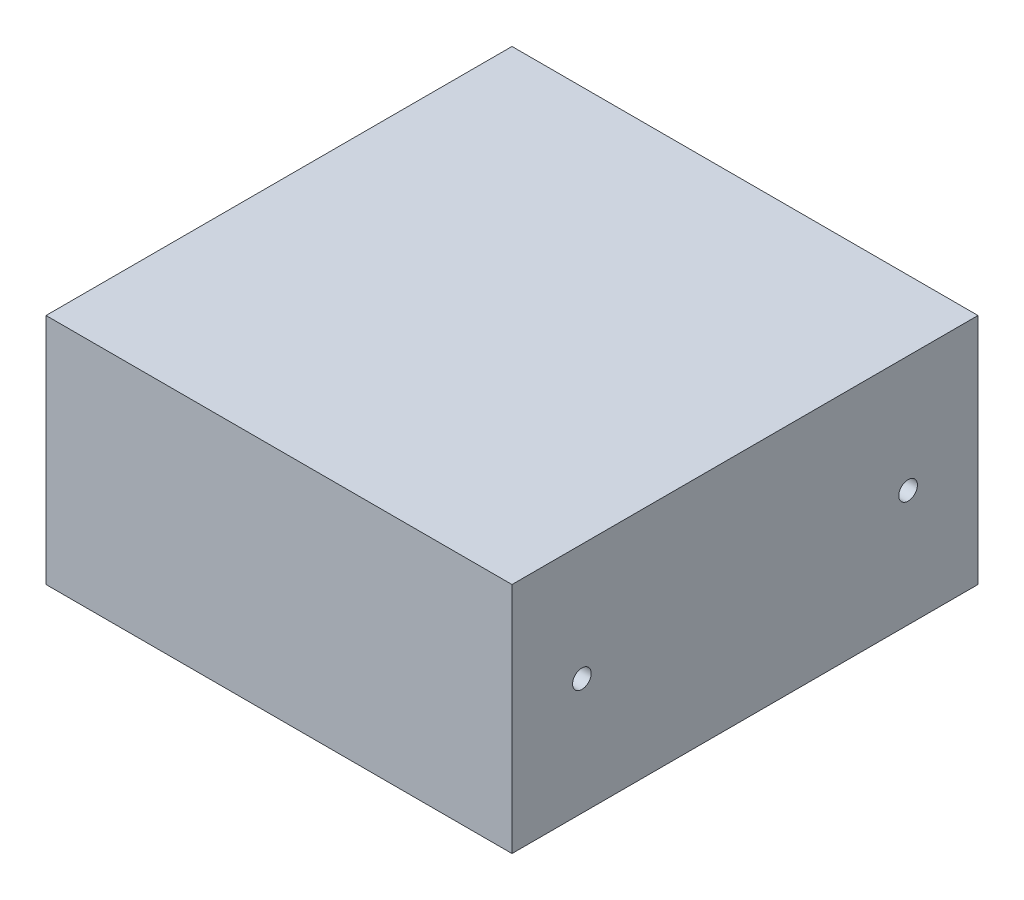
ISO-10303-21;
HEADER;
FILE_DESCRIPTION(('STEP AP214'),'2;1');
FILE_NAME('part.step','',(''),(''),'','','');
FILE_SCHEMA(('AUTOMOTIVE_DESIGN { 1 0 10303 214 1 1 1 1 }'));
ENDSEC;
DATA;
#1=APPLICATION_CONTEXT('core data for automotive mechanical design processes');
#2=APPLICATION_PROTOCOL_DEFINITION('international standard','automotive_design',2000,#1);
#3=PRODUCT_CONTEXT('',#1,'mechanical');
#4=PRODUCT('Part','Part','',(#3));
#5=PRODUCT_RELATED_PRODUCT_CATEGORY('part','',(#4));
#6=PRODUCT_DEFINITION_FORMATION('','',#4);
#7=PRODUCT_DEFINITION_CONTEXT('part definition',#1,'design');
#8=PRODUCT_DEFINITION('design','',#6,#7);
#9=PRODUCT_DEFINITION_SHAPE('','',#8);
#10=(LENGTH_UNIT() NAMED_UNIT(*) SI_UNIT(.MILLI.,.METRE.));
#11=(NAMED_UNIT(*) PLANE_ANGLE_UNIT() SI_UNIT($,.RADIAN.));
#12=(NAMED_UNIT(*) SI_UNIT($,.STERADIAN.) SOLID_ANGLE_UNIT());
#13=UNCERTAINTY_MEASURE_WITH_UNIT(LENGTH_MEASURE(1.E-05),#10,'distance_accuracy_value','');
#14=(GEOMETRIC_REPRESENTATION_CONTEXT(3) GLOBAL_UNCERTAINTY_ASSIGNED_CONTEXT((#13)) GLOBAL_UNIT_ASSIGNED_CONTEXT((#10,
#11,#12)) REPRESENTATION_CONTEXT('',''));
#15=CARTESIAN_POINT('',(0.,0.,0.));
#16=DIRECTION('',(0.,0.,1.));
#17=DIRECTION('',(1.,0.,0.));
#18=AXIS2_PLACEMENT_3D('',#15,#16,#17);
#19=CARTESIAN_POINT('',(0.,50.,0.));
#20=DIRECTION('',(1.,0.,0.));
#21=DIRECTION('',(0.,0.,-1.));
#22=AXIS2_PLACEMENT_3D('',#19,#20,#21);
#23=PLANE('',#22);
#24=DIRECTION('',(0.,0.,1.));
#25=VECTOR('',#24,1.);
#26=CARTESIAN_POINT('',(0.,0.,0.));
#27=LINE('',#26,#25);
#28=CARTESIAN_POINT('',(0.,0.,-100.));
#29=VERTEX_POINT('',#28);
#30=CARTESIAN_POINT('',(0.,0.,0.));
#31=VERTEX_POINT('',#30);
#32=EDGE_CURVE('E96',#29,#31,#27,.T.);
#33=ORIENTED_EDGE('',*,*,#32,.T.);
#34=DIRECTION('',(0.,-1.,0.));
#35=VECTOR('',#34,1.);
#36=CARTESIAN_POINT('',(0.,50.,0.));
#37=LINE('',#36,#35);
#38=CARTESIAN_POINT('',(0.,50.,0.));
#39=VERTEX_POINT('',#38);
#40=EDGE_CURVE('E11',#39,#31,#37,.T.);
#41=ORIENTED_EDGE('',*,*,#40,.F.);
#42=DIRECTION('',(0.,0.,1.));
#43=VECTOR('',#42,1.);
#44=CARTESIAN_POINT('',(0.,50.,0.));
#45=LINE('',#44,#43);
#46=CARTESIAN_POINT('',(0.,50.,-100.));
#47=VERTEX_POINT('',#46);
#48=EDGE_CURVE('E84',#47,#39,#45,.T.);
#49=ORIENTED_EDGE('',*,*,#48,.F.);
#50=DIRECTION('',(0.,-1.,0.));
#51=VECTOR('',#50,1.);
#52=CARTESIAN_POINT('',(0.,50.,-100.));
#53=LINE('',#52,#51);
#54=EDGE_CURVE('E92',#47,#29,#53,.T.);
#55=ORIENTED_EDGE('',*,*,#54,.T.);
#56=EDGE_LOOP('',(#33,#41,#49,#55));
#57=FACE_BOUND('',#56,.T.);
#58=ADVANCED_FACE('F33',(#57),#23,.F.);
#59=CARTESIAN_POINT('',(0.,50.,0.));
#60=DIRECTION('',(0.,0.,-1.));
#61=DIRECTION('',(-1.,0.,0.));
#62=AXIS2_PLACEMENT_3D('',#59,#60,#61);
#63=PLANE('',#62);
#64=DIRECTION('',(1.,0.,0.));
#65=VECTOR('',#64,1.);
#66=CARTESIAN_POINT('',(0.,0.,0.));
#67=LINE('',#66,#65);
#68=CARTESIAN_POINT('',(100.,0.,0.));
#69=VERTEX_POINT('',#68);
#70=EDGE_CURVE('E88',#31,#69,#67,.T.);
#71=ORIENTED_EDGE('',*,*,#70,.T.);
#72=DIRECTION('',(0.,-1.,0.));
#73=VECTOR('',#72,1.);
#74=CARTESIAN_POINT('',(100.,50.,0.));
#75=LINE('',#74,#73);
#76=CARTESIAN_POINT('',(100.,50.,0.));
#77=VERTEX_POINT('',#76);
#78=EDGE_CURVE('E41',#77,#69,#75,.T.);
#79=ORIENTED_EDGE('',*,*,#78,.F.);
#80=DIRECTION('',(1.,0.,0.));
#81=VECTOR('',#80,1.);
#82=CARTESIAN_POINT('',(0.,50.,0.));
#83=LINE('',#82,#81);
#84=EDGE_CURVE('E79',#39,#77,#83,.T.);
#85=ORIENTED_EDGE('',*,*,#84,.F.);
#86=ORIENTED_EDGE('',*,*,#40,.T.);
#87=EDGE_LOOP('',(#71,#79,#85,#86));
#88=FACE_BOUND('',#87,.T.);
#89=ADVANCED_FACE('F87',(#88),#63,.F.);
#90=CARTESIAN_POINT('',(100.,50.,0.));
#91=DIRECTION('',(-1.,0.,0.));
#92=DIRECTION('',(0.,0.,1.));
#93=AXIS2_PLACEMENT_3D('',#90,#91,#92);
#94=PLANE('',#93);
#95=CARTESIAN_POINT('',(100.,25.,-85.));
#96=DIRECTION('',(1.,0.,0.));
#97=DIRECTION('',(0.,0.,-1.));
#98=AXIS2_PLACEMENT_3D('',#95,#96,#97);
#99=CIRCLE('',#98,2.);
#100=CARTESIAN_POINT('',(100.,25.,-87.));
#101=VERTEX_POINT('',#100);
#102=EDGE_CURVE('E116',#101,#101,#99,.T.);
#103=ORIENTED_EDGE('',*,*,#102,.F.);
#104=EDGE_LOOP('',(#103));
#105=FACE_BOUND('',#104,.T.);
#106=CARTESIAN_POINT('',(100.,25.,-15.));
#107=DIRECTION('',(1.,0.,0.));
#108=DIRECTION('',(0.,0.,-1.));
#109=AXIS2_PLACEMENT_3D('',#106,#107,#108);
#110=CIRCLE('',#109,2.);
#111=CARTESIAN_POINT('',(100.,25.,-17.));
#112=VERTEX_POINT('',#111);
#113=EDGE_CURVE('E110',#112,#112,#110,.T.);
#114=ORIENTED_EDGE('',*,*,#113,.F.);
#115=EDGE_LOOP('',(#114));
#116=FACE_BOUND('',#115,.T.);
#117=DIRECTION('',(0.,0.,-1.));
#118=VECTOR('',#117,1.);
#119=CARTESIAN_POINT('',(100.,0.,0.));
#120=LINE('',#119,#118);
#121=CARTESIAN_POINT('',(100.,0.,-100.));
#122=VERTEX_POINT('',#121);
#123=EDGE_CURVE('E66',#69,#122,#120,.T.);
#124=ORIENTED_EDGE('',*,*,#123,.T.);
#125=DIRECTION('',(0.,-1.,0.));
#126=VECTOR('',#125,1.);
#127=CARTESIAN_POINT('',(100.,50.,-100.));
#128=LINE('',#127,#126);
#129=CARTESIAN_POINT('',(100.,50.,-100.));
#130=VERTEX_POINT('',#129);
#131=EDGE_CURVE('E89',#130,#122,#128,.T.);
#132=ORIENTED_EDGE('',*,*,#131,.F.);
#133=DIRECTION('',(0.,0.,-1.));
#134=VECTOR('',#133,1.);
#135=CARTESIAN_POINT('',(100.,50.,0.));
#136=LINE('',#135,#134);
#137=EDGE_CURVE('E82',#77,#130,#136,.T.);
#138=ORIENTED_EDGE('',*,*,#137,.F.);
#139=ORIENTED_EDGE('',*,*,#78,.T.);
#140=EDGE_LOOP('',(#124,#132,#138,#139));
#141=FACE_BOUND('',#140,.T.);
#142=ADVANCED_FACE('F90',(#105,#116,#141),#94,.F.);
#143=CARTESIAN_POINT('',(0.,50.,-100.));
#144=DIRECTION('',(0.,0.,1.));
#145=DIRECTION('',(1.,0.,0.));
#146=AXIS2_PLACEMENT_3D('',#143,#144,#145);
#147=PLANE('',#146);
#148=DIRECTION('',(-1.,0.,0.));
#149=VECTOR('',#148,1.);
#150=CARTESIAN_POINT('',(0.,0.,-100.));
#151=LINE('',#150,#149);
#152=EDGE_CURVE('E72',#122,#29,#151,.T.);
#153=ORIENTED_EDGE('',*,*,#152,.T.);
#154=ORIENTED_EDGE('',*,*,#54,.F.);
#155=DIRECTION('',(-1.,0.,0.));
#156=VECTOR('',#155,1.);
#157=CARTESIAN_POINT('',(0.,50.,-100.));
#158=LINE('',#157,#156);
#159=EDGE_CURVE('E49',#130,#47,#158,.T.);
#160=ORIENTED_EDGE('',*,*,#159,.F.);
#161=ORIENTED_EDGE('',*,*,#131,.T.);
#162=EDGE_LOOP('',(#153,#154,#160,#161));
#163=FACE_BOUND('',#162,.T.);
#164=ADVANCED_FACE('F104',(#163),#147,.F.);
#165=CARTESIAN_POINT('',(0.,50.,0.));
#166=DIRECTION('',(0.,-1.,0.));
#167=DIRECTION('',(0.,0.,-1.));
#168=AXIS2_PLACEMENT_3D('',#165,#166,#167);
#169=PLANE('',#168);
#170=ORIENTED_EDGE('',*,*,#48,.T.);
#171=ORIENTED_EDGE('',*,*,#84,.T.);
#172=ORIENTED_EDGE('',*,*,#137,.T.);
#173=ORIENTED_EDGE('',*,*,#159,.T.);
#174=EDGE_LOOP('',(#170,#171,#172,#173));
#175=FACE_BOUND('',#174,.T.);
#176=ADVANCED_FACE('F80',(#175),#169,.F.);
#177=CARTESIAN_POINT('',(0.,0.,0.));
#178=DIRECTION('',(0.,-1.,0.));
#179=DIRECTION('',(0.,0.,-1.));
#180=AXIS2_PLACEMENT_3D('',#177,#178,#179);
#181=PLANE('',#180);
#182=ORIENTED_EDGE('',*,*,#32,.F.);
#183=ORIENTED_EDGE('',*,*,#152,.F.);
#184=ORIENTED_EDGE('',*,*,#123,.F.);
#185=ORIENTED_EDGE('',*,*,#70,.F.);
#186=EDGE_LOOP('',(#182,#183,#184,#185));
#187=FACE_BOUND('',#186,.T.);
#188=ADVANCED_FACE('F107',(#187),#181,.T.);
#189=CARTESIAN_POINT('',(90.,25.,-15.));
#190=DIRECTION('',(1.,0.,0.));
#191=DIRECTION('',(0.,0.,-1.));
#192=AXIS2_PLACEMENT_3D('',#189,#190,#191);
#193=CYLINDRICAL_SURFACE('',#192,2.);
#194=CARTESIAN_POINT('',(90.,25.,-15.));
#195=DIRECTION('',(1.,0.,0.));
#196=DIRECTION('',(0.,0.,-1.));
#197=AXIS2_PLACEMENT_3D('',#194,#195,#196);
#198=CIRCLE('',#197,2.);
#199=CARTESIAN_POINT('',(90.,25.,-17.));
#200=VERTEX_POINT('',#199);
#201=EDGE_CURVE('E99',#200,#200,#198,.T.);
#202=ORIENTED_EDGE('',*,*,#201,.F.);
#203=EDGE_LOOP('',(#202));
#204=FACE_BOUND('',#203,.T.);
#205=ORIENTED_EDGE('',*,*,#113,.T.);
#206=EDGE_LOOP('',(#205));
#207=FACE_BOUND('',#206,.T.);
#208=ADVANCED_FACE('F136',(#204,#207),#193,.F.);
#209=CARTESIAN_POINT('',(90.,25.,-15.));
#210=DIRECTION('',(1.,0.,0.));
#211=DIRECTION('',(0.,0.,-1.));
#212=AXIS2_PLACEMENT_3D('',#209,#210,#211);
#213=PLANE('',#212);
#214=ORIENTED_EDGE('',*,*,#201,.T.);
#215=EDGE_LOOP('',(#214));
#216=FACE_BOUND('',#215,.T.);
#217=ADVANCED_FACE('F127',(#216),#213,.T.);
#218=CARTESIAN_POINT('',(90.,25.,-85.));
#219=DIRECTION('',(1.,0.,0.));
#220=DIRECTION('',(0.,0.,-1.));
#221=AXIS2_PLACEMENT_3D('',#218,#219,#220);
#222=CYLINDRICAL_SURFACE('',#221,2.);
#223=CARTESIAN_POINT('',(90.,25.,-85.));
#224=DIRECTION('',(1.,0.,0.));
#225=DIRECTION('',(0.,0.,-1.));
#226=AXIS2_PLACEMENT_3D('',#223,#224,#225);
#227=CIRCLE('',#226,2.);
#228=CARTESIAN_POINT('',(90.,25.,-87.));
#229=VERTEX_POINT('',#228);
#230=EDGE_CURVE('E113',#229,#229,#227,.T.);
#231=ORIENTED_EDGE('',*,*,#230,.F.);
#232=EDGE_LOOP('',(#231));
#233=FACE_BOUND('',#232,.T.);
#234=ORIENTED_EDGE('',*,*,#102,.T.);
#235=EDGE_LOOP('',(#234));
#236=FACE_BOUND('',#235,.T.);
#237=ADVANCED_FACE('F124',(#233,#236),#222,.F.);
#238=CARTESIAN_POINT('',(90.,25.,-85.));
#239=DIRECTION('',(1.,0.,0.));
#240=DIRECTION('',(0.,0.,-1.));
#241=AXIS2_PLACEMENT_3D('',#238,#239,#240);
#242=PLANE('',#241);
#243=ORIENTED_EDGE('',*,*,#230,.T.);
#244=EDGE_LOOP('',(#243));
#245=FACE_BOUND('',#244,.T.);
#246=ADVANCED_FACE('F122',(#245),#242,.T.);
#247=CLOSED_SHELL('',(#58,#89,#142,#164,#176,#188,#208,#217,#237,#246));
#248=MANIFOLD_SOLID_BREP('B2',#247);
#249=ADVANCED_BREP_SHAPE_REPRESENTATION('',(#18,#248),#14);
#250=SHAPE_DEFINITION_REPRESENTATION(#9,#249);
ENDSEC;
END-ISO-10303-21;
